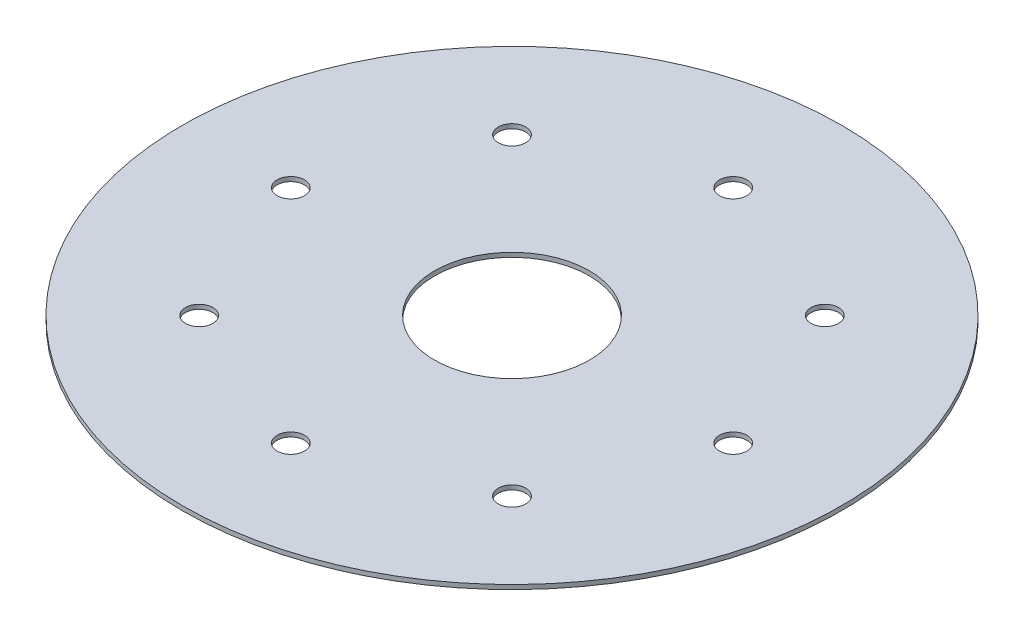
ISO-10303-21;
HEADER;
FILE_DESCRIPTION(('STEP AP214'),'2;1');
FILE_NAME('part.step','',(''),(''),'','','');
FILE_SCHEMA(('AUTOMOTIVE_DESIGN { 1 0 10303 214 1 1 1 1 }'));
ENDSEC;
DATA;
#1=APPLICATION_CONTEXT('core data for automotive mechanical design processes');
#2=APPLICATION_PROTOCOL_DEFINITION('international standard','automotive_design',2000,#1);
#3=PRODUCT_CONTEXT('',#1,'mechanical');
#4=PRODUCT('Part','Part','',(#3));
#5=PRODUCT_RELATED_PRODUCT_CATEGORY('part','',(#4));
#6=PRODUCT_DEFINITION_FORMATION('','',#4);
#7=PRODUCT_DEFINITION_CONTEXT('part definition',#1,'design');
#8=PRODUCT_DEFINITION('design','',#6,#7);
#9=PRODUCT_DEFINITION_SHAPE('','',#8);
#10=(LENGTH_UNIT() NAMED_UNIT(*) SI_UNIT(.MILLI.,.METRE.));
#11=(NAMED_UNIT(*) PLANE_ANGLE_UNIT() SI_UNIT($,.RADIAN.));
#12=(NAMED_UNIT(*) SI_UNIT($,.STERADIAN.) SOLID_ANGLE_UNIT());
#13=UNCERTAINTY_MEASURE_WITH_UNIT(LENGTH_MEASURE(1.E-05),#10,'distance_accuracy_value','');
#14=(GEOMETRIC_REPRESENTATION_CONTEXT(3) GLOBAL_UNCERTAINTY_ASSIGNED_CONTEXT((#13)) GLOBAL_UNIT_ASSIGNED_CONTEXT((#10,
#11,#12)) REPRESENTATION_CONTEXT('',''));
#15=CARTESIAN_POINT('',(0.,0.,0.));
#16=DIRECTION('',(0.,0.,1.));
#17=DIRECTION('',(1.,0.,0.));
#18=AXIS2_PLACEMENT_3D('',#15,#16,#17);
#19=CARTESIAN_POINT('',(0.,-45.,0.));
#20=DIRECTION('',(0.,-1.,0.));
#21=DIRECTION('',(0.,0.,-1.));
#22=AXIS2_PLACEMENT_3D('',#19,#20,#21);
#23=PLANE('',#22);
#24=CARTESIAN_POINT('',(0.,-45.,50.0000000000001));
#25=DIRECTION('',(0.,-1.,0.));
#26=DIRECTION('',(0.,0.,-1.));
#27=AXIS2_PLACEMENT_3D('',#24,#25,#26);
#28=CIRCLE('',#27,3.1);
#29=CARTESIAN_POINT('',(0.,-45.,46.9000000000001));
#30=VERTEX_POINT('',#29);
#31=EDGE_CURVE('E82',#30,#30,#28,.T.);
#32=ORIENTED_EDGE('',*,*,#31,.F.);
#33=EDGE_LOOP('',(#32));
#34=FACE_BOUND('',#33,.T.);
#35=CARTESIAN_POINT('',(35.3553390593274,-45.,35.3553390593274));
#36=DIRECTION('',(0.,-1.,0.));
#37=DIRECTION('',(0.,0.,-1.));
#38=AXIS2_PLACEMENT_3D('',#35,#36,#37);
#39=CIRCLE('',#38,3.1);
#40=CARTESIAN_POINT('',(35.3553390593274,-45.,32.2553390593274));
#41=VERTEX_POINT('',#40);
#42=EDGE_CURVE('E70',#41,#41,#39,.T.);
#43=ORIENTED_EDGE('',*,*,#42,.F.);
#44=EDGE_LOOP('',(#43));
#45=FACE_BOUND('',#44,.T.);
#46=CARTESIAN_POINT('',(-50.,-45.,0.));
#47=DIRECTION('',(0.,-1.,0.));
#48=DIRECTION('',(0.,0.,-1.));
#49=AXIS2_PLACEMENT_3D('',#46,#47,#48);
#50=CIRCLE('',#49,3.1);
#51=CARTESIAN_POINT('',(-50.,-45.,-3.09999999999994));
#52=VERTEX_POINT('',#51);
#53=EDGE_CURVE('E58',#52,#52,#50,.T.);
#54=ORIENTED_EDGE('',*,*,#53,.F.);
#55=EDGE_LOOP('',(#54));
#56=FACE_BOUND('',#55,.T.);
#57=CARTESIAN_POINT('',(0.,-45.,-49.9999999999999));
#58=DIRECTION('',(0.,-1.,0.));
#59=DIRECTION('',(0.,0.,-1.));
#60=AXIS2_PLACEMENT_3D('',#57,#58,#59);
#61=CIRCLE('',#60,3.1);
#62=CARTESIAN_POINT('',(0.,-45.,-53.0999999999999));
#63=VERTEX_POINT('',#62);
#64=EDGE_CURVE('E46',#63,#63,#61,.T.);
#65=ORIENTED_EDGE('',*,*,#64,.F.);
#66=EDGE_LOOP('',(#65));
#67=FACE_BOUND('',#66,.T.);
#68=CARTESIAN_POINT('',(0.,-45.,0.));
#69=DIRECTION('',(0.,-1.,0.));
#70=DIRECTION('',(0.,0.,-1.));
#71=AXIS2_PLACEMENT_3D('',#68,#69,#70);
#72=CIRCLE('',#71,74.5);
#73=CARTESIAN_POINT('',(0.,-45.,-74.5));
#74=VERTEX_POINT('',#73);
#75=EDGE_CURVE('E10',#74,#74,#72,.T.);
#76=ORIENTED_EDGE('',*,*,#75,.T.);
#77=EDGE_LOOP('',(#76));
#78=FACE_BOUND('',#77,.T.);
#79=CARTESIAN_POINT('',(35.3553390593274,-45.,-35.3553390593273));
#80=DIRECTION('',(0.,-1.,0.));
#81=DIRECTION('',(0.,0.,-1.));
#82=AXIS2_PLACEMENT_3D('',#79,#80,#81);
#83=CIRCLE('',#82,3.1);
#84=CARTESIAN_POINT('',(35.3553390593274,-45.,-38.4553390593273));
#85=VERTEX_POINT('',#84);
#86=EDGE_CURVE('E41',#85,#85,#83,.T.);
#87=ORIENTED_EDGE('',*,*,#86,.F.);
#88=EDGE_LOOP('',(#87));
#89=FACE_BOUND('',#88,.T.);
#90=CARTESIAN_POINT('',(-35.3553390593274,-45.,-35.3553390593273));
#91=DIRECTION('',(0.,-1.,0.));
#92=DIRECTION('',(0.,0.,-1.));
#93=AXIS2_PLACEMENT_3D('',#90,#91,#92);
#94=CIRCLE('',#93,3.09999999999999);
#95=CARTESIAN_POINT('',(-35.3553390593274,-45.,-38.4553390593273));
#96=VERTEX_POINT('',#95);
#97=EDGE_CURVE('E52',#96,#96,#94,.T.);
#98=ORIENTED_EDGE('',*,*,#97,.F.);
#99=EDGE_LOOP('',(#98));
#100=FACE_BOUND('',#99,.T.);
#101=CARTESIAN_POINT('',(50.,-45.,0.));
#102=DIRECTION('',(0.,-1.,0.));
#103=DIRECTION('',(0.,0.,-1.));
#104=AXIS2_PLACEMENT_3D('',#101,#102,#103);
#105=CIRCLE('',#104,3.1);
#106=CARTESIAN_POINT('',(50.,-45.,-3.09999999999995));
#107=VERTEX_POINT('',#106);
#108=EDGE_CURVE('E64',#107,#107,#105,.T.);
#109=ORIENTED_EDGE('',*,*,#108,.F.);
#110=EDGE_LOOP('',(#109));
#111=FACE_BOUND('',#110,.T.);
#112=CARTESIAN_POINT('',(-35.3553390593274,-45.,35.3553390593275));
#113=DIRECTION('',(0.,-1.,0.));
#114=DIRECTION('',(0.,0.,-1.));
#115=AXIS2_PLACEMENT_3D('',#112,#113,#114);
#116=CIRCLE('',#115,3.09999999999999);
#117=CARTESIAN_POINT('',(-35.3553390593274,-45.,32.2553390593275));
#118=VERTEX_POINT('',#117);
#119=EDGE_CURVE('E76',#118,#118,#116,.T.);
#120=ORIENTED_EDGE('',*,*,#119,.F.);
#121=EDGE_LOOP('',(#120));
#122=FACE_BOUND('',#121,.T.);
#123=CARTESIAN_POINT('',(0.,-45.,0.));
#124=DIRECTION('',(0.,-1.,0.));
#125=DIRECTION('',(0.,0.,-1.));
#126=AXIS2_PLACEMENT_3D('',#123,#124,#125);
#127=CIRCLE('',#126,17.5);
#128=CARTESIAN_POINT('',(0.,-45.,-17.5));
#129=VERTEX_POINT('',#128);
#130=EDGE_CURVE('E88',#129,#129,#127,.T.);
#131=ORIENTED_EDGE('',*,*,#130,.F.);
#132=EDGE_LOOP('',(#131));
#133=FACE_BOUND('',#132,.T.);
#134=ADVANCED_FACE('F30',(#34,#45,#56,#67,#78,#89,#100,#111,#122,#133),#23,.T.);
#135=CARTESIAN_POINT('',(0.,-44.,0.));
#136=DIRECTION('',(0.,-1.,0.));
#137=DIRECTION('',(0.,0.,-1.));
#138=AXIS2_PLACEMENT_3D('',#135,#136,#137);
#139=PLANE('',#138);
#140=CARTESIAN_POINT('',(0.,-44.,0.));
#141=DIRECTION('',(0.,-1.,0.));
#142=DIRECTION('',(0.,0.,-1.));
#143=AXIS2_PLACEMENT_3D('',#140,#141,#142);
#144=CIRCLE('',#143,74.5);
#145=CARTESIAN_POINT('',(0.,-44.,-74.5));
#146=VERTEX_POINT('',#145);
#147=EDGE_CURVE('E34',#146,#146,#144,.T.);
#148=ORIENTED_EDGE('',*,*,#147,.F.);
#149=EDGE_LOOP('',(#148));
#150=FACE_BOUND('',#149,.T.);
#151=CARTESIAN_POINT('',(35.3553390593274,-44.,-35.3553390593273));
#152=DIRECTION('',(0.,-1.,0.));
#153=DIRECTION('',(0.,0.,-1.));
#154=AXIS2_PLACEMENT_3D('',#151,#152,#153);
#155=CIRCLE('',#154,3.1);
#156=CARTESIAN_POINT('',(35.3553390593274,-44.,-38.4553390593273));
#157=VERTEX_POINT('',#156);
#158=EDGE_CURVE('E43',#157,#157,#155,.T.);
#159=ORIENTED_EDGE('',*,*,#158,.T.);
#160=EDGE_LOOP('',(#159));
#161=FACE_BOUND('',#160,.T.);
#162=CARTESIAN_POINT('',(0.,-44.,-49.9999999999999));
#163=DIRECTION('',(0.,-1.,0.));
#164=DIRECTION('',(0.,0.,-1.));
#165=AXIS2_PLACEMENT_3D('',#162,#163,#164);
#166=CIRCLE('',#165,3.1);
#167=CARTESIAN_POINT('',(0.,-44.,-53.0999999999999));
#168=VERTEX_POINT('',#167);
#169=EDGE_CURVE('E49',#168,#168,#166,.T.);
#170=ORIENTED_EDGE('',*,*,#169,.T.);
#171=EDGE_LOOP('',(#170));
#172=FACE_BOUND('',#171,.T.);
#173=CARTESIAN_POINT('',(-35.3553390593274,-44.,-35.3553390593273));
#174=DIRECTION('',(0.,-1.,0.));
#175=DIRECTION('',(0.,0.,-1.));
#176=AXIS2_PLACEMENT_3D('',#173,#174,#175);
#177=CIRCLE('',#176,3.09999999999999);
#178=CARTESIAN_POINT('',(-35.3553390593274,-44.,-38.4553390593273));
#179=VERTEX_POINT('',#178);
#180=EDGE_CURVE('E55',#179,#179,#177,.T.);
#181=ORIENTED_EDGE('',*,*,#180,.T.);
#182=EDGE_LOOP('',(#181));
#183=FACE_BOUND('',#182,.T.);
#184=CARTESIAN_POINT('',(-50.,-44.,0.));
#185=DIRECTION('',(0.,-1.,0.));
#186=DIRECTION('',(0.,0.,-1.));
#187=AXIS2_PLACEMENT_3D('',#184,#185,#186);
#188=CIRCLE('',#187,3.1);
#189=CARTESIAN_POINT('',(-50.,-44.,-3.09999999999994));
#190=VERTEX_POINT('',#189);
#191=EDGE_CURVE('E61',#190,#190,#188,.T.);
#192=ORIENTED_EDGE('',*,*,#191,.T.);
#193=EDGE_LOOP('',(#192));
#194=FACE_BOUND('',#193,.T.);
#195=CARTESIAN_POINT('',(50.,-44.,0.));
#196=DIRECTION('',(0.,-1.,0.));
#197=DIRECTION('',(0.,0.,-1.));
#198=AXIS2_PLACEMENT_3D('',#195,#196,#197);
#199=CIRCLE('',#198,3.1);
#200=CARTESIAN_POINT('',(50.,-44.,-3.09999999999995));
#201=VERTEX_POINT('',#200);
#202=EDGE_CURVE('E67',#201,#201,#199,.T.);
#203=ORIENTED_EDGE('',*,*,#202,.T.);
#204=EDGE_LOOP('',(#203));
#205=FACE_BOUND('',#204,.T.);
#206=CARTESIAN_POINT('',(35.3553390593274,-44.,35.3553390593274));
#207=DIRECTION('',(0.,-1.,0.));
#208=DIRECTION('',(0.,0.,-1.));
#209=AXIS2_PLACEMENT_3D('',#206,#207,#208);
#210=CIRCLE('',#209,3.1);
#211=CARTESIAN_POINT('',(35.3553390593274,-44.,32.2553390593274));
#212=VERTEX_POINT('',#211);
#213=EDGE_CURVE('E73',#212,#212,#210,.T.);
#214=ORIENTED_EDGE('',*,*,#213,.T.);
#215=EDGE_LOOP('',(#214));
#216=FACE_BOUND('',#215,.T.);
#217=CARTESIAN_POINT('',(-35.3553390593274,-44.,35.3553390593275));
#218=DIRECTION('',(0.,-1.,0.));
#219=DIRECTION('',(0.,0.,-1.));
#220=AXIS2_PLACEMENT_3D('',#217,#218,#219);
#221=CIRCLE('',#220,3.09999999999999);
#222=CARTESIAN_POINT('',(-35.3553390593274,-44.,32.2553390593275));
#223=VERTEX_POINT('',#222);
#224=EDGE_CURVE('E79',#223,#223,#221,.T.);
#225=ORIENTED_EDGE('',*,*,#224,.T.);
#226=EDGE_LOOP('',(#225));
#227=FACE_BOUND('',#226,.T.);
#228=CARTESIAN_POINT('',(0.,-44.,50.0000000000001));
#229=DIRECTION('',(0.,-1.,0.));
#230=DIRECTION('',(0.,0.,-1.));
#231=AXIS2_PLACEMENT_3D('',#228,#229,#230);
#232=CIRCLE('',#231,3.1);
#233=CARTESIAN_POINT('',(0.,-44.,46.9000000000001));
#234=VERTEX_POINT('',#233);
#235=EDGE_CURVE('E85',#234,#234,#232,.T.);
#236=ORIENTED_EDGE('',*,*,#235,.T.);
#237=EDGE_LOOP('',(#236));
#238=FACE_BOUND('',#237,.T.);
#239=CARTESIAN_POINT('',(0.,-44.,0.));
#240=DIRECTION('',(0.,-1.,0.));
#241=DIRECTION('',(0.,0.,-1.));
#242=AXIS2_PLACEMENT_3D('',#239,#240,#241);
#243=CIRCLE('',#242,17.5);
#244=CARTESIAN_POINT('',(0.,-44.,-17.5));
#245=VERTEX_POINT('',#244);
#246=EDGE_CURVE('E91',#245,#245,#243,.T.);
#247=ORIENTED_EDGE('',*,*,#246,.T.);
#248=EDGE_LOOP('',(#247));
#249=FACE_BOUND('',#248,.T.);
#250=ADVANCED_FACE('F101',(#150,#161,#172,#183,#194,#205,#216,#227,#238,#249),#139,.F.);
#251=CARTESIAN_POINT('',(0.,-45.,0.));
#252=DIRECTION('',(0.,1.,0.));
#253=DIRECTION('',(0.,0.,1.));
#254=AXIS2_PLACEMENT_3D('',#251,#252,#253);
#255=CYLINDRICAL_SURFACE('',#254,74.5);
#256=ORIENTED_EDGE('',*,*,#75,.F.);
#257=EDGE_LOOP('',(#256));
#258=FACE_BOUND('',#257,.T.);
#259=ORIENTED_EDGE('',*,*,#147,.T.);
#260=EDGE_LOOP('',(#259));
#261=FACE_BOUND('',#260,.T.);
#262=ADVANCED_FACE('F32',(#258,#261),#255,.T.);
#263=CARTESIAN_POINT('',(35.3553390593274,-45.,-35.3553390593273));
#264=DIRECTION('',(0.,1.,0.));
#265=DIRECTION('',(0.,0.,1.));
#266=AXIS2_PLACEMENT_3D('',#263,#264,#265);
#267=CYLINDRICAL_SURFACE('',#266,3.1);
#268=ORIENTED_EDGE('',*,*,#86,.T.);
#269=EDGE_LOOP('',(#268));
#270=FACE_BOUND('',#269,.T.);
#271=ORIENTED_EDGE('',*,*,#158,.F.);
#272=EDGE_LOOP('',(#271));
#273=FACE_BOUND('',#272,.T.);
#274=ADVANCED_FACE('F111',(#270,#273),#267,.F.);
#275=CARTESIAN_POINT('',(0.,-45.,-49.9999999999999));
#276=DIRECTION('',(0.,1.,0.));
#277=DIRECTION('',(0.,0.,1.));
#278=AXIS2_PLACEMENT_3D('',#275,#276,#277);
#279=CYLINDRICAL_SURFACE('',#278,3.1);
#280=ORIENTED_EDGE('',*,*,#64,.T.);
#281=EDGE_LOOP('',(#280));
#282=FACE_BOUND('',#281,.T.);
#283=ORIENTED_EDGE('',*,*,#169,.F.);
#284=EDGE_LOOP('',(#283));
#285=FACE_BOUND('',#284,.T.);
#286=ADVANCED_FACE('F114',(#282,#285),#279,.F.);
#287=CARTESIAN_POINT('',(-35.3553390593274,-45.,-35.3553390593273));
#288=DIRECTION('',(0.,1.,0.));
#289=DIRECTION('',(0.,0.,1.));
#290=AXIS2_PLACEMENT_3D('',#287,#288,#289);
#291=CYLINDRICAL_SURFACE('',#290,3.09999999999999);
#292=ORIENTED_EDGE('',*,*,#97,.T.);
#293=EDGE_LOOP('',(#292));
#294=FACE_BOUND('',#293,.T.);
#295=ORIENTED_EDGE('',*,*,#180,.F.);
#296=EDGE_LOOP('',(#295));
#297=FACE_BOUND('',#296,.T.);
#298=ADVANCED_FACE('F118',(#294,#297),#291,.F.);
#299=CARTESIAN_POINT('',(-50.,-45.,0.));
#300=DIRECTION('',(0.,1.,0.));
#301=DIRECTION('',(0.,0.,1.));
#302=AXIS2_PLACEMENT_3D('',#299,#300,#301);
#303=CYLINDRICAL_SURFACE('',#302,3.1);
#304=ORIENTED_EDGE('',*,*,#53,.T.);
#305=EDGE_LOOP('',(#304));
#306=FACE_BOUND('',#305,.T.);
#307=ORIENTED_EDGE('',*,*,#191,.F.);
#308=EDGE_LOOP('',(#307));
#309=FACE_BOUND('',#308,.T.);
#310=ADVANCED_FACE('F122',(#306,#309),#303,.F.);
#311=CARTESIAN_POINT('',(50.,-45.,0.));
#312=DIRECTION('',(0.,1.,0.));
#313=DIRECTION('',(0.,0.,1.));
#314=AXIS2_PLACEMENT_3D('',#311,#312,#313);
#315=CYLINDRICAL_SURFACE('',#314,3.1);
#316=ORIENTED_EDGE('',*,*,#108,.T.);
#317=EDGE_LOOP('',(#316));
#318=FACE_BOUND('',#317,.T.);
#319=ORIENTED_EDGE('',*,*,#202,.F.);
#320=EDGE_LOOP('',(#319));
#321=FACE_BOUND('',#320,.T.);
#322=ADVANCED_FACE('F126',(#318,#321),#315,.F.);
#323=CARTESIAN_POINT('',(35.3553390593274,-45.,35.3553390593274));
#324=DIRECTION('',(0.,1.,0.));
#325=DIRECTION('',(0.,0.,1.));
#326=AXIS2_PLACEMENT_3D('',#323,#324,#325);
#327=CYLINDRICAL_SURFACE('',#326,3.1);
#328=ORIENTED_EDGE('',*,*,#42,.T.);
#329=EDGE_LOOP('',(#328));
#330=FACE_BOUND('',#329,.T.);
#331=ORIENTED_EDGE('',*,*,#213,.F.);
#332=EDGE_LOOP('',(#331));
#333=FACE_BOUND('',#332,.T.);
#334=ADVANCED_FACE('F130',(#330,#333),#327,.F.);
#335=CARTESIAN_POINT('',(-35.3553390593274,-45.,35.3553390593275));
#336=DIRECTION('',(0.,1.,0.));
#337=DIRECTION('',(0.,0.,1.));
#338=AXIS2_PLACEMENT_3D('',#335,#336,#337);
#339=CYLINDRICAL_SURFACE('',#338,3.09999999999999);
#340=ORIENTED_EDGE('',*,*,#119,.T.);
#341=EDGE_LOOP('',(#340));
#342=FACE_BOUND('',#341,.T.);
#343=ORIENTED_EDGE('',*,*,#224,.F.);
#344=EDGE_LOOP('',(#343));
#345=FACE_BOUND('',#344,.T.);
#346=ADVANCED_FACE('F134',(#342,#345),#339,.F.);
#347=CARTESIAN_POINT('',(0.,-45.,50.0000000000001));
#348=DIRECTION('',(0.,1.,0.));
#349=DIRECTION('',(0.,0.,1.));
#350=AXIS2_PLACEMENT_3D('',#347,#348,#349);
#351=CYLINDRICAL_SURFACE('',#350,3.1);
#352=ORIENTED_EDGE('',*,*,#31,.T.);
#353=EDGE_LOOP('',(#352));
#354=FACE_BOUND('',#353,.T.);
#355=ORIENTED_EDGE('',*,*,#235,.F.);
#356=EDGE_LOOP('',(#355));
#357=FACE_BOUND('',#356,.T.);
#358=ADVANCED_FACE('F138',(#354,#357),#351,.F.);
#359=CARTESIAN_POINT('',(0.,-45.,0.));
#360=DIRECTION('',(0.,1.,0.));
#361=DIRECTION('',(0.,0.,1.));
#362=AXIS2_PLACEMENT_3D('',#359,#360,#361);
#363=CYLINDRICAL_SURFACE('',#362,17.5);
#364=ORIENTED_EDGE('',*,*,#130,.T.);
#365=EDGE_LOOP('',(#364));
#366=FACE_BOUND('',#365,.T.);
#367=ORIENTED_EDGE('',*,*,#246,.F.);
#368=EDGE_LOOP('',(#367));
#369=FACE_BOUND('',#368,.T.);
#370=ADVANCED_FACE('F97',(#366,#369),#363,.F.);
#371=CLOSED_SHELL('',(#134,#250,#262,#274,#286,#298,#310,#322,#334,#346,#358,#370));
#372=MANIFOLD_SOLID_BREP('B2',#371);
#373=ADVANCED_BREP_SHAPE_REPRESENTATION('',(#18,#372),#14);
#374=SHAPE_DEFINITION_REPRESENTATION(#9,#373);
ENDSEC;
END-ISO-10303-21;
